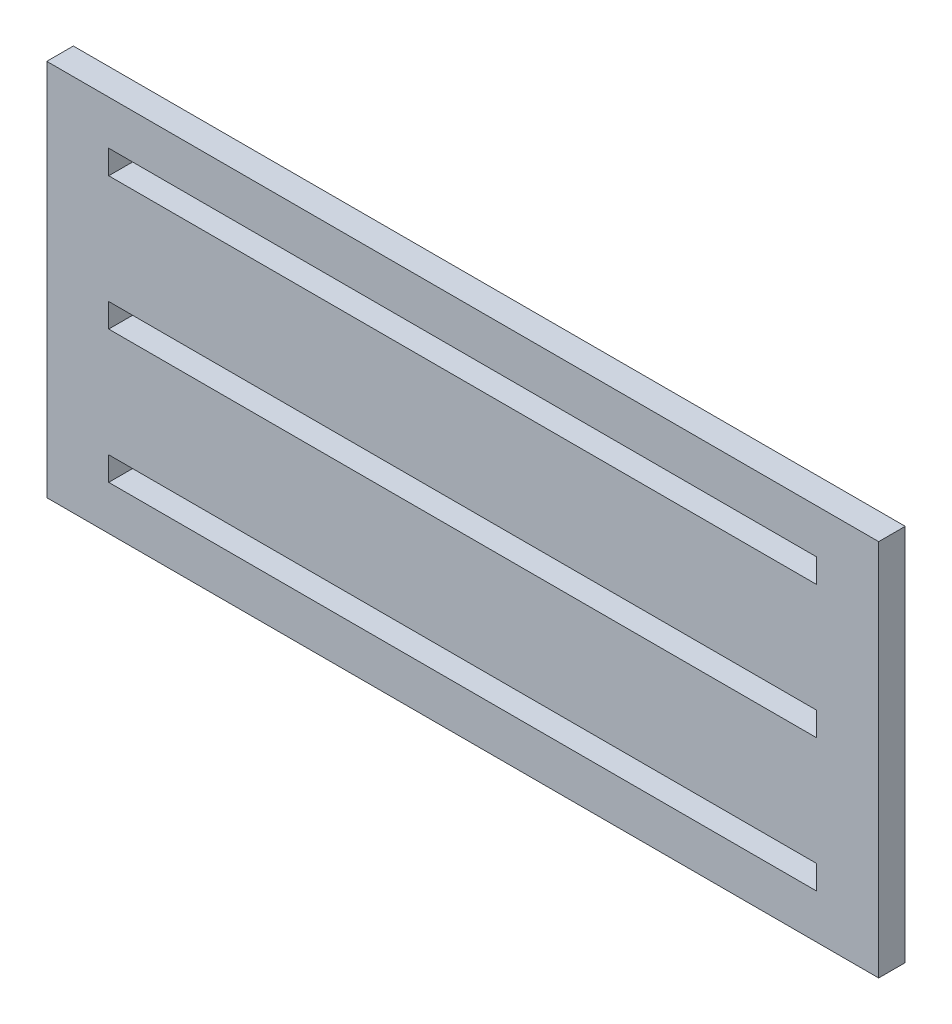
ISO-10303-21;
HEADER;
FILE_DESCRIPTION(('STEP AP214'),'2;1');
FILE_NAME('part.step','',(''),(''),'','','');
FILE_SCHEMA(('AUTOMOTIVE_DESIGN { 1 0 10303 214 1 1 1 1 }'));
ENDSEC;
DATA;
#1=APPLICATION_CONTEXT('core data for automotive mechanical design processes');
#2=APPLICATION_PROTOCOL_DEFINITION('international standard','automotive_design',2000,#1);
#3=PRODUCT_CONTEXT('',#1,'mechanical');
#4=PRODUCT('Part','Part','',(#3));
#5=PRODUCT_RELATED_PRODUCT_CATEGORY('part','',(#4));
#6=PRODUCT_DEFINITION_FORMATION('','',#4);
#7=PRODUCT_DEFINITION_CONTEXT('part definition',#1,'design');
#8=PRODUCT_DEFINITION('design','',#6,#7);
#9=PRODUCT_DEFINITION_SHAPE('','',#8);
#10=(LENGTH_UNIT() NAMED_UNIT(*) SI_UNIT(.MILLI.,.METRE.));
#11=(NAMED_UNIT(*) PLANE_ANGLE_UNIT() SI_UNIT($,.RADIAN.));
#12=(NAMED_UNIT(*) SI_UNIT($,.STERADIAN.) SOLID_ANGLE_UNIT());
#13=UNCERTAINTY_MEASURE_WITH_UNIT(LENGTH_MEASURE(1.E-05),#10,'distance_accuracy_value','');
#14=(GEOMETRIC_REPRESENTATION_CONTEXT(3) GLOBAL_UNCERTAINTY_ASSIGNED_CONTEXT((#13)) GLOBAL_UNIT_ASSIGNED_CONTEXT((#10,
#11,#12)) REPRESENTATION_CONTEXT('',''));
#15=CARTESIAN_POINT('',(0.,0.,0.));
#16=DIRECTION('',(0.,0.,1.));
#17=DIRECTION('',(1.,0.,0.));
#18=AXIS2_PLACEMENT_3D('',#15,#16,#17);
#19=CARTESIAN_POINT('',(0.,0.,3.));
#20=DIRECTION('',(0.,0.,-1.));
#21=DIRECTION('',(-1.,0.,0.));
#22=AXIS2_PLACEMENT_3D('',#19,#20,#21);
#23=PLANE('',#22);
#24=DIRECTION('',(0.,-1.,0.));
#25=VECTOR('',#24,1.);
#26=CARTESIAN_POINT('',(-6.33215110127922,9.18914552401055,3.));
#27=LINE('',#26,#25);
#28=CARTESIAN_POINT('',(-6.33215110127922,11.8891455240105,3.));
#29=VERTEX_POINT('',#28);
#30=CARTESIAN_POINT('',(-6.33215110127922,9.18914552401055,3.));
#31=VERTEX_POINT('',#30);
#32=EDGE_CURVE('E181',#29,#31,#27,.T.);
#33=ORIENTED_EDGE('',*,*,#32,.F.);
#34=DIRECTION('',(-1.,0.,0.));
#35=VECTOR('',#34,1.);
#36=CARTESIAN_POINT('',(-6.33215110127922,11.8891455240105,3.));
#37=LINE('',#36,#35);
#38=CARTESIAN_POINT('',(73.6678488987208,11.8891455240106,3.));
#39=VERTEX_POINT('',#38);
#40=EDGE_CURVE('E189',#39,#29,#37,.T.);
#41=ORIENTED_EDGE('',*,*,#40,.F.);
#42=DIRECTION('',(0.,1.,0.));
#43=VECTOR('',#42,1.);
#44=CARTESIAN_POINT('',(73.6678488987208,9.18914552401055,3.));
#45=LINE('',#44,#43);
#46=CARTESIAN_POINT('',(73.6678488987208,9.18914552401055,3.));
#47=VERTEX_POINT('',#46);
#48=EDGE_CURVE('E186',#47,#39,#45,.T.);
#49=ORIENTED_EDGE('',*,*,#48,.F.);
#50=DIRECTION('',(1.,0.,0.));
#51=VECTOR('',#50,1.);
#52=CARTESIAN_POINT('',(-6.33215110127922,9.18914552401055,3.));
#53=LINE('',#52,#51);
#54=EDGE_CURVE('E183',#31,#47,#53,.T.);
#55=ORIENTED_EDGE('',*,*,#54,.F.);
#56=EDGE_LOOP('',(#33,#41,#49,#55));
#57=FACE_BOUND('',#56,.T.);
#58=DIRECTION('',(0.,-1.,0.));
#59=VECTOR('',#58,1.);
#60=CARTESIAN_POINT('',(-13.3321511012792,-25.8108544759895,3.));
#61=LINE('',#60,#59);
#62=CARTESIAN_POINT('',(-13.3321511012792,16.8891455240106,3.));
#63=VERTEX_POINT('',#62);
#64=CARTESIAN_POINT('',(-13.3321511012792,-25.8108544759895,3.));
#65=VERTEX_POINT('',#64);
#66=EDGE_CURVE('E243',#63,#65,#61,.T.);
#67=ORIENTED_EDGE('',*,*,#66,.T.);
#68=DIRECTION('',(1.,0.,0.));
#69=VECTOR('',#68,1.);
#70=CARTESIAN_POINT('',(-13.3321511012792,-25.8108544759895,3.));
#71=LINE('',#70,#69);
#72=CARTESIAN_POINT('',(80.6678488987208,-25.8108544759895,3.));
#73=VERTEX_POINT('',#72);
#74=EDGE_CURVE('E246',#65,#73,#71,.T.);
#75=ORIENTED_EDGE('',*,*,#74,.T.);
#76=DIRECTION('',(0.,1.,0.));
#77=VECTOR('',#76,1.);
#78=CARTESIAN_POINT('',(80.6678488987208,-25.8108544759895,3.));
#79=LINE('',#78,#77);
#80=CARTESIAN_POINT('',(80.6678488987208,16.8891455240106,3.));
#81=VERTEX_POINT('',#80);
#82=EDGE_CURVE('E249',#73,#81,#79,.T.);
#83=ORIENTED_EDGE('',*,*,#82,.T.);
#84=DIRECTION('',(-1.,0.,0.));
#85=VECTOR('',#84,1.);
#86=CARTESIAN_POINT('',(-13.3321511012792,16.8891455240106,3.));
#87=LINE('',#86,#85);
#88=EDGE_CURVE('E251',#81,#63,#87,.T.);
#89=ORIENTED_EDGE('',*,*,#88,.T.);
#90=EDGE_LOOP('',(#67,#75,#83,#89));
#91=FACE_BOUND('',#90,.T.);
#92=DIRECTION('',(0.,-1.,0.));
#93=VECTOR('',#92,1.);
#94=CARTESIAN_POINT('',(-6.33215110127921,-3.11085447598945,3.));
#95=LINE('',#94,#93);
#96=CARTESIAN_POINT('',(-6.33215110127921,-3.11085447598945,3.));
#97=VERTEX_POINT('',#96);
#98=CARTESIAN_POINT('',(-6.33215110127921,-5.81085447598945,3.));
#99=VERTEX_POINT('',#98);
#100=EDGE_CURVE('E212',#97,#99,#95,.T.);
#101=ORIENTED_EDGE('',*,*,#100,.F.);
#102=DIRECTION('',(-1.,0.,0.));
#103=VECTOR('',#102,1.);
#104=CARTESIAN_POINT('',(-6.33215110127921,-3.11085447598945,3.));
#105=LINE('',#104,#103);
#106=CARTESIAN_POINT('',(73.6678488987208,-3.11085447598945,3.));
#107=VERTEX_POINT('',#106);
#108=EDGE_CURVE('E220',#107,#97,#105,.T.);
#109=ORIENTED_EDGE('',*,*,#108,.F.);
#110=DIRECTION('',(0.,1.,0.));
#111=VECTOR('',#110,1.);
#112=CARTESIAN_POINT('',(73.6678488987208,-3.11085447598945,3.));
#113=LINE('',#112,#111);
#114=CARTESIAN_POINT('',(73.6678488987208,-5.81085447598945,3.));
#115=VERTEX_POINT('',#114);
#116=EDGE_CURVE('E217',#115,#107,#113,.T.);
#117=ORIENTED_EDGE('',*,*,#116,.F.);
#118=DIRECTION('',(1.,0.,0.));
#119=VECTOR('',#118,1.);
#120=CARTESIAN_POINT('',(-6.33215110127921,-5.81085447598945,3.));
#121=LINE('',#120,#119);
#122=EDGE_CURVE('E214',#99,#115,#121,.T.);
#123=ORIENTED_EDGE('',*,*,#122,.F.);
#124=EDGE_LOOP('',(#101,#109,#117,#123));
#125=FACE_BOUND('',#124,.T.);
#126=DIRECTION('',(0.,-1.,0.));
#127=VECTOR('',#126,1.);
#128=CARTESIAN_POINT('',(-6.33215110127922,-18.1108544759894,3.));
#129=LINE('',#128,#127);
#130=CARTESIAN_POINT('',(-6.33215110127922,-18.1108544759894,3.));
#131=VERTEX_POINT('',#130);
#132=CARTESIAN_POINT('',(-6.33215110127922,-20.8108544759894,3.));
#133=VERTEX_POINT('',#132);
#134=EDGE_CURVE('E145',#131,#133,#129,.T.);
#135=ORIENTED_EDGE('',*,*,#134,.F.);
#136=DIRECTION('',(-1.,0.,0.));
#137=VECTOR('',#136,1.);
#138=CARTESIAN_POINT('',(-6.33215110127922,-18.1108544759894,3.));
#139=LINE('',#138,#137);
#140=CARTESIAN_POINT('',(73.6678488987208,-18.1108544759894,3.));
#141=VERTEX_POINT('',#140);
#142=EDGE_CURVE('E167',#141,#131,#139,.T.);
#143=ORIENTED_EDGE('',*,*,#142,.F.);
#144=DIRECTION('',(0.,1.,0.));
#145=VECTOR('',#144,1.);
#146=CARTESIAN_POINT('',(73.6678488987208,-18.1108544759894,3.));
#147=LINE('',#146,#145);
#148=CARTESIAN_POINT('',(73.6678488987208,-20.8108544759895,3.));
#149=VERTEX_POINT('',#148);
#150=EDGE_CURVE('E165',#149,#141,#147,.T.);
#151=ORIENTED_EDGE('',*,*,#150,.F.);
#152=DIRECTION('',(1.,0.,0.));
#153=VECTOR('',#152,1.);
#154=CARTESIAN_POINT('',(-6.33215110127922,-20.8108544759894,3.));
#155=LINE('',#154,#153);
#156=EDGE_CURVE('E153',#133,#149,#155,.T.);
#157=ORIENTED_EDGE('',*,*,#156,.F.);
#158=EDGE_LOOP('',(#135,#143,#151,#157));
#159=FACE_BOUND('',#158,.T.);
#160=ADVANCED_FACE('F32',(#57,#91,#125,#159),#23,.F.);
#161=CARTESIAN_POINT('',(0.,0.,0.));
#162=DIRECTION('',(0.,0.,-1.));
#163=DIRECTION('',(-1.,0.,0.));
#164=AXIS2_PLACEMENT_3D('',#161,#162,#163);
#165=PLANE('',#164);
#166=DIRECTION('',(0.,-1.,0.));
#167=VECTOR('',#166,1.);
#168=CARTESIAN_POINT('',(-13.3321511012792,-25.8108544759895,0.));
#169=LINE('',#168,#167);
#170=CARTESIAN_POINT('',(-13.3321511012792,16.8891455240106,0.));
#171=VERTEX_POINT('',#170);
#172=CARTESIAN_POINT('',(-13.3321511012792,-25.8108544759895,0.));
#173=VERTEX_POINT('',#172);
#174=EDGE_CURVE('E242',#171,#173,#169,.T.);
#175=ORIENTED_EDGE('',*,*,#174,.F.);
#176=DIRECTION('',(-1.,0.,0.));
#177=VECTOR('',#176,1.);
#178=CARTESIAN_POINT('',(-13.3321511012792,16.8891455240106,0.));
#179=LINE('',#178,#177);
#180=CARTESIAN_POINT('',(80.6678488987208,16.8891455240106,0.));
#181=VERTEX_POINT('',#180);
#182=EDGE_CURVE('E247',#181,#171,#179,.T.);
#183=ORIENTED_EDGE('',*,*,#182,.F.);
#184=DIRECTION('',(0.,1.,0.));
#185=VECTOR('',#184,1.);
#186=CARTESIAN_POINT('',(80.6678488987208,-25.8108544759895,0.));
#187=LINE('',#186,#185);
#188=CARTESIAN_POINT('',(80.6678488987208,-25.8108544759895,0.));
#189=VERTEX_POINT('',#188);
#190=EDGE_CURVE('E258',#189,#181,#187,.T.);
#191=ORIENTED_EDGE('',*,*,#190,.F.);
#192=DIRECTION('',(1.,0.,0.));
#193=VECTOR('',#192,1.);
#194=CARTESIAN_POINT('',(-13.3321511012792,-25.8108544759895,0.));
#195=LINE('',#194,#193);
#196=EDGE_CURVE('E256',#173,#189,#195,.T.);
#197=ORIENTED_EDGE('',*,*,#196,.F.);
#198=EDGE_LOOP('',(#175,#183,#191,#197));
#199=FACE_BOUND('',#198,.T.);
#200=DIRECTION('',(-1.,0.,0.));
#201=VECTOR('',#200,1.);
#202=CARTESIAN_POINT('',(-6.33215110127921,-3.11085447598945,0.));
#203=LINE('',#202,#201);
#204=CARTESIAN_POINT('',(73.6678488987208,-3.11085447598945,0.));
#205=VERTEX_POINT('',#204);
#206=CARTESIAN_POINT('',(-6.33215110127921,-3.11085447598945,0.));
#207=VERTEX_POINT('',#206);
#208=EDGE_CURVE('E215',#205,#207,#203,.T.);
#209=ORIENTED_EDGE('',*,*,#208,.T.);
#210=DIRECTION('',(0.,-1.,0.));
#211=VECTOR('',#210,1.);
#212=CARTESIAN_POINT('',(-6.33215110127921,-3.11085447598945,0.));
#213=LINE('',#212,#211);
#214=CARTESIAN_POINT('',(-6.33215110127921,-5.81085447598945,0.));
#215=VERTEX_POINT('',#214);
#216=EDGE_CURVE('E211',#207,#215,#213,.T.);
#217=ORIENTED_EDGE('',*,*,#216,.T.);
#218=DIRECTION('',(1.,0.,0.));
#219=VECTOR('',#218,1.);
#220=CARTESIAN_POINT('',(-6.33215110127921,-5.81085447598945,0.));
#221=LINE('',#220,#219);
#222=CARTESIAN_POINT('',(73.6678488987208,-5.81085447598945,0.));
#223=VERTEX_POINT('',#222);
#224=EDGE_CURVE('E225',#215,#223,#221,.T.);
#225=ORIENTED_EDGE('',*,*,#224,.T.);
#226=DIRECTION('',(0.,1.,0.));
#227=VECTOR('',#226,1.);
#228=CARTESIAN_POINT('',(73.6678488987208,-3.11085447598945,0.));
#229=LINE('',#228,#227);
#230=EDGE_CURVE('E228',#223,#205,#229,.T.);
#231=ORIENTED_EDGE('',*,*,#230,.T.);
#232=EDGE_LOOP('',(#209,#217,#225,#231));
#233=FACE_BOUND('',#232,.T.);
#234=DIRECTION('',(-1.,0.,0.));
#235=VECTOR('',#234,1.);
#236=CARTESIAN_POINT('',(-6.33215110127922,11.8891455240105,0.));
#237=LINE('',#236,#235);
#238=CARTESIAN_POINT('',(73.6678488987208,11.8891455240106,0.));
#239=VERTEX_POINT('',#238);
#240=CARTESIAN_POINT('',(-6.33215110127922,11.8891455240105,0.));
#241=VERTEX_POINT('',#240);
#242=EDGE_CURVE('E184',#239,#241,#237,.T.);
#243=ORIENTED_EDGE('',*,*,#242,.T.);
#244=DIRECTION('',(0.,-1.,0.));
#245=VECTOR('',#244,1.);
#246=CARTESIAN_POINT('',(-6.33215110127922,9.18914552401055,0.));
#247=LINE('',#246,#245);
#248=CARTESIAN_POINT('',(-6.33215110127922,9.18914552401055,0.));
#249=VERTEX_POINT('',#248);
#250=EDGE_CURVE('E161',#241,#249,#247,.T.);
#251=ORIENTED_EDGE('',*,*,#250,.T.);
#252=DIRECTION('',(1.,0.,0.));
#253=VECTOR('',#252,1.);
#254=CARTESIAN_POINT('',(-6.33215110127922,9.18914552401055,0.));
#255=LINE('',#254,#253);
#256=CARTESIAN_POINT('',(73.6678488987208,9.18914552401055,0.));
#257=VERTEX_POINT('',#256);
#258=EDGE_CURVE('E194',#249,#257,#255,.T.);
#259=ORIENTED_EDGE('',*,*,#258,.T.);
#260=DIRECTION('',(0.,1.,0.));
#261=VECTOR('',#260,1.);
#262=CARTESIAN_POINT('',(73.6678488987208,9.18914552401055,0.));
#263=LINE('',#262,#261);
#264=EDGE_CURVE('E197',#257,#239,#263,.T.);
#265=ORIENTED_EDGE('',*,*,#264,.T.);
#266=EDGE_LOOP('',(#243,#251,#259,#265));
#267=FACE_BOUND('',#266,.T.);
#268=DIRECTION('',(-1.,0.,0.));
#269=VECTOR('',#268,1.);
#270=CARTESIAN_POINT('',(-6.33215110127922,-18.1108544759894,0.));
#271=LINE('',#270,#269);
#272=CARTESIAN_POINT('',(73.6678488987208,-18.1108544759894,0.));
#273=VERTEX_POINT('',#272);
#274=CARTESIAN_POINT('',(-6.33215110127922,-18.1108544759894,0.));
#275=VERTEX_POINT('',#274);
#276=EDGE_CURVE('E154',#273,#275,#271,.T.);
#277=ORIENTED_EDGE('',*,*,#276,.T.);
#278=DIRECTION('',(0.,-1.,0.));
#279=VECTOR('',#278,1.);
#280=CARTESIAN_POINT('',(-6.33215110127922,-18.1108544759894,0.));
#281=LINE('',#280,#279);
#282=CARTESIAN_POINT('',(-6.33215110127922,-20.8108544759894,0.));
#283=VERTEX_POINT('',#282);
#284=EDGE_CURVE('E55',#275,#283,#281,.T.);
#285=ORIENTED_EDGE('',*,*,#284,.T.);
#286=DIRECTION('',(1.,0.,0.));
#287=VECTOR('',#286,1.);
#288=CARTESIAN_POINT('',(-6.33215110127922,-20.8108544759894,0.));
#289=LINE('',#288,#287);
#290=CARTESIAN_POINT('',(73.6678488987208,-20.8108544759895,0.));
#291=VERTEX_POINT('',#290);
#292=EDGE_CURVE('E160',#283,#291,#289,.T.);
#293=ORIENTED_EDGE('',*,*,#292,.T.);
#294=DIRECTION('',(0.,1.,0.));
#295=VECTOR('',#294,1.);
#296=CARTESIAN_POINT('',(73.6678488987208,-18.1108544759894,0.));
#297=LINE('',#296,#295);
#298=EDGE_CURVE('E173',#291,#273,#297,.T.);
#299=ORIENTED_EDGE('',*,*,#298,.T.);
#300=EDGE_LOOP('',(#277,#285,#293,#299));
#301=FACE_BOUND('',#300,.T.);
#302=ADVANCED_FACE('F276',(#199,#233,#267,#301),#165,.T.);
#303=CARTESIAN_POINT('',(-13.3321511012792,-25.8108544759895,3.));
#304=DIRECTION('',(1.,0.,0.));
#305=DIRECTION('',(0.,1.,0.));
#306=AXIS2_PLACEMENT_3D('',#303,#304,#305);
#307=PLANE('',#306);
#308=ORIENTED_EDGE('',*,*,#174,.T.);
#309=DIRECTION('',(0.,0.,-1.));
#310=VECTOR('',#309,1.);
#311=CARTESIAN_POINT('',(-13.3321511012792,-25.8108544759895,3.));
#312=LINE('',#311,#310);
#313=EDGE_CURVE('E11',#65,#173,#312,.T.);
#314=ORIENTED_EDGE('',*,*,#313,.F.);
#315=ORIENTED_EDGE('',*,*,#66,.F.);
#316=DIRECTION('',(0.,0.,-1.));
#317=VECTOR('',#316,1.);
#318=CARTESIAN_POINT('',(-13.3321511012792,16.8891455240106,3.));
#319=LINE('',#318,#317);
#320=EDGE_CURVE('E253',#63,#171,#319,.T.);
#321=ORIENTED_EDGE('',*,*,#320,.T.);
#322=EDGE_LOOP('',(#308,#314,#315,#321));
#323=FACE_BOUND('',#322,.T.);
#324=ADVANCED_FACE('F34',(#323),#307,.F.);
#325=CARTESIAN_POINT('',(-13.3321511012792,-25.8108544759895,3.));
#326=DIRECTION('',(0.,1.,0.));
#327=DIRECTION('',(0.,0.,1.));
#328=AXIS2_PLACEMENT_3D('',#325,#326,#327);
#329=PLANE('',#328);
#330=ORIENTED_EDGE('',*,*,#196,.T.);
#331=DIRECTION('',(0.,0.,-1.));
#332=VECTOR('',#331,1.);
#333=CARTESIAN_POINT('',(80.6678488987208,-25.8108544759895,3.));
#334=LINE('',#333,#332);
#335=EDGE_CURVE('E40',#73,#189,#334,.T.);
#336=ORIENTED_EDGE('',*,*,#335,.F.);
#337=ORIENTED_EDGE('',*,*,#74,.F.);
#338=ORIENTED_EDGE('',*,*,#313,.T.);
#339=EDGE_LOOP('',(#330,#336,#337,#338));
#340=FACE_BOUND('',#339,.T.);
#341=ADVANCED_FACE('F287',(#340),#329,.F.);
#342=CARTESIAN_POINT('',(80.6678488987208,-25.8108544759895,3.));
#343=DIRECTION('',(-1.,0.,0.));
#344=DIRECTION('',(0.,-1.,0.));
#345=AXIS2_PLACEMENT_3D('',#342,#343,#344);
#346=PLANE('',#345);
#347=ORIENTED_EDGE('',*,*,#190,.T.);
#348=DIRECTION('',(0.,0.,-1.));
#349=VECTOR('',#348,1.);
#350=CARTESIAN_POINT('',(80.6678488987208,16.8891455240106,3.));
#351=LINE('',#350,#349);
#352=EDGE_CURVE('E263',#81,#181,#351,.T.);
#353=ORIENTED_EDGE('',*,*,#352,.F.);
#354=ORIENTED_EDGE('',*,*,#82,.F.);
#355=ORIENTED_EDGE('',*,*,#335,.T.);
#356=EDGE_LOOP('',(#347,#353,#354,#355));
#357=FACE_BOUND('',#356,.T.);
#358=ADVANCED_FACE('F270',(#357),#346,.F.);
#359=CARTESIAN_POINT('',(-13.3321511012792,16.8891455240106,3.));
#360=DIRECTION('',(0.,-1.,0.));
#361=DIRECTION('',(1.,0.,0.));
#362=AXIS2_PLACEMENT_3D('',#359,#360,#361);
#363=PLANE('',#362);
#364=ORIENTED_EDGE('',*,*,#182,.T.);
#365=ORIENTED_EDGE('',*,*,#320,.F.);
#366=ORIENTED_EDGE('',*,*,#88,.F.);
#367=ORIENTED_EDGE('',*,*,#352,.T.);
#368=EDGE_LOOP('',(#364,#365,#366,#367));
#369=FACE_BOUND('',#368,.T.);
#370=ADVANCED_FACE('F280',(#369),#363,.F.);
#371=CARTESIAN_POINT('',(-6.33215110127921,-3.11085447598945,3.));
#372=DIRECTION('',(1.,0.,0.));
#373=DIRECTION('',(0.,0.,-1.));
#374=AXIS2_PLACEMENT_3D('',#371,#372,#373);
#375=PLANE('',#374);
#376=ORIENTED_EDGE('',*,*,#216,.F.);
#377=DIRECTION('',(0.,0.,-1.));
#378=VECTOR('',#377,1.);
#379=CARTESIAN_POINT('',(-6.33215110127921,-3.11085447598945,3.));
#380=LINE('',#379,#378);
#381=EDGE_CURVE('E222',#97,#207,#380,.T.);
#382=ORIENTED_EDGE('',*,*,#381,.F.);
#383=ORIENTED_EDGE('',*,*,#100,.T.);
#384=DIRECTION('',(0.,0.,-1.));
#385=VECTOR('',#384,1.);
#386=CARTESIAN_POINT('',(-6.33215110127921,-5.81085447598945,3.));
#387=LINE('',#386,#385);
#388=EDGE_CURVE('E239',#99,#215,#387,.T.);
#389=ORIENTED_EDGE('',*,*,#388,.T.);
#390=EDGE_LOOP('',(#376,#382,#383,#389));
#391=FACE_BOUND('',#390,.T.);
#392=ADVANCED_FACE('F303',(#391),#375,.T.);
#393=CARTESIAN_POINT('',(-6.33215110127921,-5.81085447598945,3.));
#394=DIRECTION('',(0.,1.,0.));
#395=DIRECTION('',(0.,0.,1.));
#396=AXIS2_PLACEMENT_3D('',#393,#394,#395);
#397=PLANE('',#396);
#398=ORIENTED_EDGE('',*,*,#224,.F.);
#399=ORIENTED_EDGE('',*,*,#388,.F.);
#400=ORIENTED_EDGE('',*,*,#122,.T.);
#401=DIRECTION('',(0.,0.,-1.));
#402=VECTOR('',#401,1.);
#403=CARTESIAN_POINT('',(73.6678488987208,-5.81085447598945,3.));
#404=LINE('',#403,#402);
#405=EDGE_CURVE('E237',#115,#223,#404,.T.);
#406=ORIENTED_EDGE('',*,*,#405,.T.);
#407=EDGE_LOOP('',(#398,#399,#400,#406));
#408=FACE_BOUND('',#407,.T.);
#409=ADVANCED_FACE('F310',(#408),#397,.T.);
#410=CARTESIAN_POINT('',(73.6678488987208,-3.11085447598945,3.));
#411=DIRECTION('',(-1.,0.,0.));
#412=DIRECTION('',(0.,0.,1.));
#413=AXIS2_PLACEMENT_3D('',#410,#411,#412);
#414=PLANE('',#413);
#415=ORIENTED_EDGE('',*,*,#230,.F.);
#416=ORIENTED_EDGE('',*,*,#405,.F.);
#417=ORIENTED_EDGE('',*,*,#116,.T.);
#418=DIRECTION('',(0.,0.,-1.));
#419=VECTOR('',#418,1.);
#420=CARTESIAN_POINT('',(73.6678488987208,-3.11085447598945,3.));
#421=LINE('',#420,#419);
#422=EDGE_CURVE('E235',#107,#205,#421,.T.);
#423=ORIENTED_EDGE('',*,*,#422,.T.);
#424=EDGE_LOOP('',(#415,#416,#417,#423));
#425=FACE_BOUND('',#424,.T.);
#426=ADVANCED_FACE('F315',(#425),#414,.T.);
#427=CARTESIAN_POINT('',(-6.33215110127921,-3.11085447598945,3.));
#428=DIRECTION('',(0.,-1.,0.));
#429=DIRECTION('',(0.,0.,-1.));
#430=AXIS2_PLACEMENT_3D('',#427,#428,#429);
#431=PLANE('',#430);
#432=ORIENTED_EDGE('',*,*,#208,.F.);
#433=ORIENTED_EDGE('',*,*,#422,.F.);
#434=ORIENTED_EDGE('',*,*,#108,.T.);
#435=ORIENTED_EDGE('',*,*,#381,.T.);
#436=EDGE_LOOP('',(#432,#433,#434,#435));
#437=FACE_BOUND('',#436,.T.);
#438=ADVANCED_FACE('F322',(#437),#431,.T.);
#439=CARTESIAN_POINT('',(-6.33215110127922,9.18914552401055,3.));
#440=DIRECTION('',(1.,0.,0.));
#441=DIRECTION('',(0.,0.,-1.));
#442=AXIS2_PLACEMENT_3D('',#439,#440,#441);
#443=PLANE('',#442);
#444=ORIENTED_EDGE('',*,*,#250,.F.);
#445=DIRECTION('',(0.,0.,-1.));
#446=VECTOR('',#445,1.);
#447=CARTESIAN_POINT('',(-6.33215110127922,11.8891455240105,3.));
#448=LINE('',#447,#446);
#449=EDGE_CURVE('E191',#29,#241,#448,.T.);
#450=ORIENTED_EDGE('',*,*,#449,.F.);
#451=ORIENTED_EDGE('',*,*,#32,.T.);
#452=DIRECTION('',(0.,0.,-1.));
#453=VECTOR('',#452,1.);
#454=CARTESIAN_POINT('',(-6.33215110127922,9.18914552401055,3.));
#455=LINE('',#454,#453);
#456=EDGE_CURVE('E208',#31,#249,#455,.T.);
#457=ORIENTED_EDGE('',*,*,#456,.T.);
#458=EDGE_LOOP('',(#444,#450,#451,#457));
#459=FACE_BOUND('',#458,.T.);
#460=ADVANCED_FACE('F335',(#459),#443,.T.);
#461=CARTESIAN_POINT('',(-6.33215110127922,9.18914552401055,3.));
#462=DIRECTION('',(0.,1.,0.));
#463=DIRECTION('',(-1.,0.,0.));
#464=AXIS2_PLACEMENT_3D('',#461,#462,#463);
#465=PLANE('',#464);
#466=ORIENTED_EDGE('',*,*,#258,.F.);
#467=ORIENTED_EDGE('',*,*,#456,.F.);
#468=ORIENTED_EDGE('',*,*,#54,.T.);
#469=DIRECTION('',(0.,0.,-1.));
#470=VECTOR('',#469,1.);
#471=CARTESIAN_POINT('',(73.6678488987208,9.18914552401055,3.));
#472=LINE('',#471,#470);
#473=EDGE_CURVE('E206',#47,#257,#472,.T.);
#474=ORIENTED_EDGE('',*,*,#473,.T.);
#475=EDGE_LOOP('',(#466,#467,#468,#474));
#476=FACE_BOUND('',#475,.T.);
#477=ADVANCED_FACE('F340',(#476),#465,.T.);
#478=CARTESIAN_POINT('',(73.6678488987208,9.18914552401055,3.));
#479=DIRECTION('',(-1.,0.,0.));
#480=DIRECTION('',(0.,0.,1.));
#481=AXIS2_PLACEMENT_3D('',#478,#479,#480);
#482=PLANE('',#481);
#483=ORIENTED_EDGE('',*,*,#264,.F.);
#484=ORIENTED_EDGE('',*,*,#473,.F.);
#485=ORIENTED_EDGE('',*,*,#48,.T.);
#486=DIRECTION('',(0.,0.,-1.));
#487=VECTOR('',#486,1.);
#488=CARTESIAN_POINT('',(73.6678488987208,11.8891455240106,3.));
#489=LINE('',#488,#487);
#490=EDGE_CURVE('E204',#39,#239,#489,.T.);
#491=ORIENTED_EDGE('',*,*,#490,.T.);
#492=EDGE_LOOP('',(#483,#484,#485,#491));
#493=FACE_BOUND('',#492,.T.);
#494=ADVANCED_FACE('F344',(#493),#482,.T.);
#495=CARTESIAN_POINT('',(-6.33215110127922,11.8891455240105,3.));
#496=DIRECTION('',(0.,-1.,0.));
#497=DIRECTION('',(1.,0.,0.));
#498=AXIS2_PLACEMENT_3D('',#495,#496,#497);
#499=PLANE('',#498);
#500=ORIENTED_EDGE('',*,*,#242,.F.);
#501=ORIENTED_EDGE('',*,*,#490,.F.);
#502=ORIENTED_EDGE('',*,*,#40,.T.);
#503=ORIENTED_EDGE('',*,*,#449,.T.);
#504=EDGE_LOOP('',(#500,#501,#502,#503));
#505=FACE_BOUND('',#504,.T.);
#506=ADVANCED_FACE('F348',(#505),#499,.T.);
#507=CARTESIAN_POINT('',(-6.33215110127922,-18.1108544759894,3.));
#508=DIRECTION('',(1.,0.,0.));
#509=DIRECTION('',(0.,0.,-1.));
#510=AXIS2_PLACEMENT_3D('',#507,#508,#509);
#511=PLANE('',#510);
#512=ORIENTED_EDGE('',*,*,#284,.F.);
#513=DIRECTION('',(0.,0.,-1.));
#514=VECTOR('',#513,1.);
#515=CARTESIAN_POINT('',(-6.33215110127922,-18.1108544759894,3.));
#516=LINE('',#515,#514);
#517=EDGE_CURVE('E149',#131,#275,#516,.T.);
#518=ORIENTED_EDGE('',*,*,#517,.F.);
#519=ORIENTED_EDGE('',*,*,#134,.T.);
#520=DIRECTION('',(0.,0.,-1.));
#521=VECTOR('',#520,1.);
#522=CARTESIAN_POINT('',(-6.33215110127922,-20.8108544759894,3.));
#523=LINE('',#522,#521);
#524=EDGE_CURVE('E148',#133,#283,#523,.T.);
#525=ORIENTED_EDGE('',*,*,#524,.T.);
#526=EDGE_LOOP('',(#512,#518,#519,#525));
#527=FACE_BOUND('',#526,.T.);
#528=ADVANCED_FACE('F147',(#527),#511,.T.);
#529=CARTESIAN_POINT('',(-6.33215110127922,-20.8108544759894,3.));
#530=DIRECTION('',(0.,1.,0.));
#531=DIRECTION('',(-1.,0.,0.));
#532=AXIS2_PLACEMENT_3D('',#529,#530,#531);
#533=PLANE('',#532);
#534=ORIENTED_EDGE('',*,*,#292,.F.);
#535=ORIENTED_EDGE('',*,*,#524,.F.);
#536=ORIENTED_EDGE('',*,*,#156,.T.);
#537=DIRECTION('',(0.,0.,-1.));
#538=VECTOR('',#537,1.);
#539=CARTESIAN_POINT('',(73.6678488987208,-20.8108544759895,3.));
#540=LINE('',#539,#538);
#541=EDGE_CURVE('E162',#149,#291,#540,.T.);
#542=ORIENTED_EDGE('',*,*,#541,.T.);
#543=EDGE_LOOP('',(#534,#535,#536,#542));
#544=FACE_BOUND('',#543,.T.);
#545=ADVANCED_FACE('F157',(#544),#533,.T.);
#546=CARTESIAN_POINT('',(73.6678488987208,-18.1108544759894,3.));
#547=DIRECTION('',(-1.,0.,0.));
#548=DIRECTION('',(0.,0.,1.));
#549=AXIS2_PLACEMENT_3D('',#546,#547,#548);
#550=PLANE('',#549);
#551=ORIENTED_EDGE('',*,*,#298,.F.);
#552=ORIENTED_EDGE('',*,*,#541,.F.);
#553=ORIENTED_EDGE('',*,*,#150,.T.);
#554=DIRECTION('',(0.,0.,-1.));
#555=VECTOR('',#554,1.);
#556=CARTESIAN_POINT('',(73.6678488987208,-18.1108544759894,3.));
#557=LINE('',#556,#555);
#558=EDGE_CURVE('E47',#141,#273,#557,.T.);
#559=ORIENTED_EDGE('',*,*,#558,.T.);
#560=EDGE_LOOP('',(#551,#552,#553,#559));
#561=FACE_BOUND('',#560,.T.);
#562=ADVANCED_FACE('F357',(#561),#550,.T.);
#563=CARTESIAN_POINT('',(-6.33215110127922,-18.1108544759894,3.));
#564=DIRECTION('',(0.,-1.,0.));
#565=DIRECTION('',(1.,0.,0.));
#566=AXIS2_PLACEMENT_3D('',#563,#564,#565);
#567=PLANE('',#566);
#568=ORIENTED_EDGE('',*,*,#276,.F.);
#569=ORIENTED_EDGE('',*,*,#558,.F.);
#570=ORIENTED_EDGE('',*,*,#142,.T.);
#571=ORIENTED_EDGE('',*,*,#517,.T.);
#572=EDGE_LOOP('',(#568,#569,#570,#571));
#573=FACE_BOUND('',#572,.T.);
#574=ADVANCED_FACE('F360',(#573),#567,.T.);
#575=CLOSED_SHELL('',(#160,#302,#324,#341,#358,#370,#392,#409,#426,#438,#460,#477,#494,#506,
#528,#545,#562,#574));
#576=MANIFOLD_SOLID_BREP('B2',#575);
#577=ADVANCED_BREP_SHAPE_REPRESENTATION('',(#18,#576),#14);
#578=SHAPE_DEFINITION_REPRESENTATION(#9,#577);
ENDSEC;
END-ISO-10303-21;
